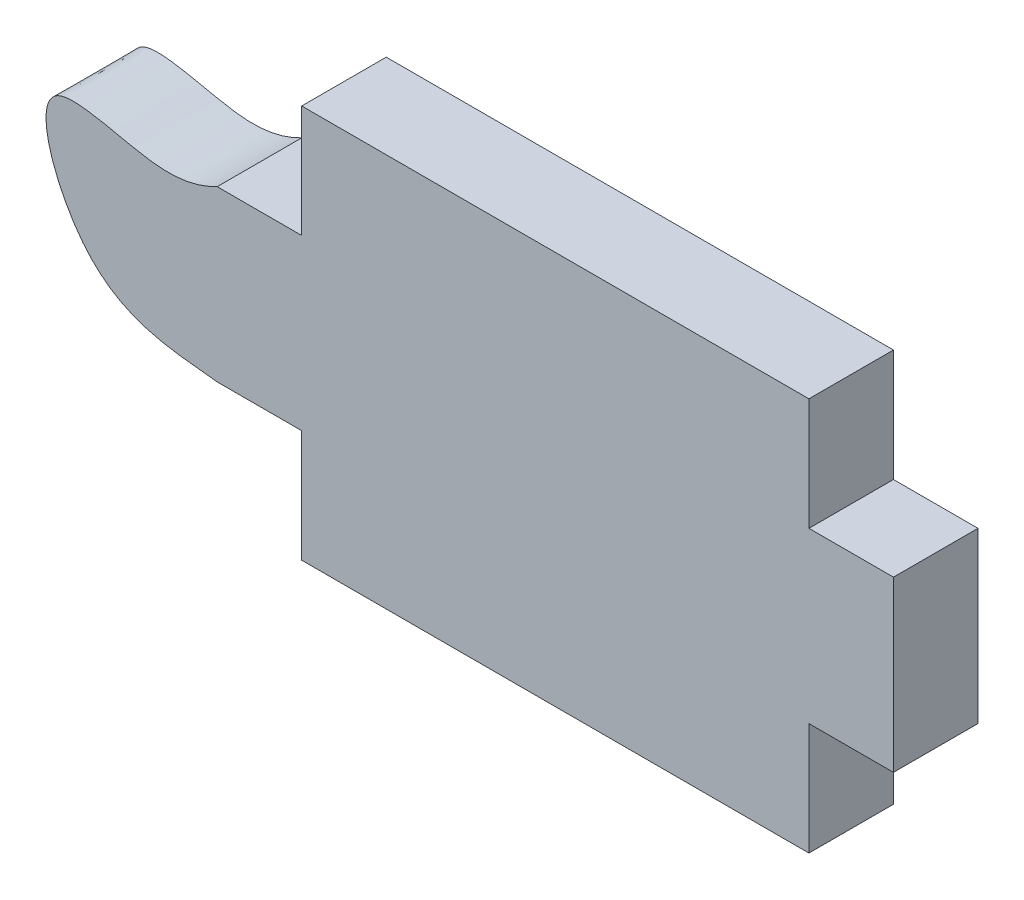
ISO-10303-21;
HEADER;
FILE_DESCRIPTION(('STEP AP214'),'2;1');
FILE_NAME('part.step','',(''),(''),'','','');
FILE_SCHEMA(('AUTOMOTIVE_DESIGN { 1 0 10303 214 1 1 1 1 }'));
ENDSEC;
DATA;
#1=APPLICATION_CONTEXT('core data for automotive mechanical design processes');
#2=APPLICATION_PROTOCOL_DEFINITION('international standard','automotive_design',2000,#1);
#3=PRODUCT_CONTEXT('',#1,'mechanical');
#4=PRODUCT('Part','Part','',(#3));
#5=PRODUCT_RELATED_PRODUCT_CATEGORY('part','',(#4));
#6=PRODUCT_DEFINITION_FORMATION('','',#4);
#7=PRODUCT_DEFINITION_CONTEXT('part definition',#1,'design');
#8=PRODUCT_DEFINITION('design','',#6,#7);
#9=PRODUCT_DEFINITION_SHAPE('','',#8);
#10=(LENGTH_UNIT() NAMED_UNIT(*) SI_UNIT(.MILLI.,.METRE.));
#11=(NAMED_UNIT(*) PLANE_ANGLE_UNIT() SI_UNIT($,.RADIAN.));
#12=(NAMED_UNIT(*) SI_UNIT($,.STERADIAN.) SOLID_ANGLE_UNIT());
#13=UNCERTAINTY_MEASURE_WITH_UNIT(LENGTH_MEASURE(1.E-05),#10,'distance_accuracy_value','');
#14=(GEOMETRIC_REPRESENTATION_CONTEXT(3) GLOBAL_UNCERTAINTY_ASSIGNED_CONTEXT((#13)) GLOBAL_UNIT_ASSIGNED_CONTEXT((#10,
#11,#12)) REPRESENTATION_CONTEXT('',''));
#15=CARTESIAN_POINT('',(0.,0.,0.));
#16=DIRECTION('',(0.,0.,1.));
#17=DIRECTION('',(1.,0.,0.));
#18=AXIS2_PLACEMENT_3D('',#15,#16,#17);
#19=CARTESIAN_POINT('',(-3.17499999999997,64.9634215549388,-3.175));
#20=DIRECTION('',(0.,-1.,0.));
#21=DIRECTION('',(0.,0.,-1.));
#22=AXIS2_PLACEMENT_3D('',#19,#20,#21);
#23=PLANE('',#22);
#24=DIRECTION('',(1.,0.,0.));
#25=VECTOR('',#24,1.);
#26=CARTESIAN_POINT('',(-3.17499999999997,64.9634215549388,0.));
#27=LINE('',#26,#25);
#28=CARTESIAN_POINT('',(-3.17499999999997,64.9634215549389,0.));
#29=VERTEX_POINT('',#28);
#30=CARTESIAN_POINT('',(0.,64.9634215549388,0.));
#31=VERTEX_POINT('',#30);
#32=EDGE_CURVE('E158',#29,#31,#27,.T.);
#33=ORIENTED_EDGE('',*,*,#32,.F.);
#34=DIRECTION('',(0.,0.,1.));
#35=VECTOR('',#34,1.);
#36=CARTESIAN_POINT('',(-3.17499999999997,64.9634215549389,-3.175));
#37=LINE('',#36,#35);
#38=CARTESIAN_POINT('',(-3.17499999999997,64.9634215549389,-3.175));
#39=VERTEX_POINT('',#38);
#40=EDGE_CURVE('E11',#39,#29,#37,.T.);
#41=ORIENTED_EDGE('',*,*,#40,.F.);
#42=DIRECTION('',(1.,0.,0.));
#43=VECTOR('',#42,1.);
#44=CARTESIAN_POINT('',(-3.17499999999997,64.9634215549388,-3.175));
#45=LINE('',#44,#43);
#46=CARTESIAN_POINT('',(0.,64.9634215549388,-3.175));
#47=VERTEX_POINT('',#46);
#48=EDGE_CURVE('E240',#39,#47,#45,.T.);
#49=ORIENTED_EDGE('',*,*,#48,.T.);
#50=DIRECTION('',(0.,0.,1.));
#51=VECTOR('',#50,1.);
#52=CARTESIAN_POINT('',(0.,64.9634215549388,-3.175));
#53=LINE('',#52,#51);
#54=EDGE_CURVE('E36',#47,#31,#53,.T.);
#55=ORIENTED_EDGE('',*,*,#54,.T.);
#56=EDGE_LOOP('',(#33,#41,#49,#55));
#57=FACE_BOUND('',#56,.T.);
#58=ADVANCED_FACE('F33',(#57),#23,.T.);
#59=CARTESIAN_POINT('',(-3.17499999999997,64.9634215549389,-3.175));
#60=CARTESIAN_POINT('',(-5.1086361062681,65.1682508847472,-3.175));
#61=CARTESIAN_POINT('',(-8.26678059926956,65.288799195504,-3.175));
#62=CARTESIAN_POINT('',(-10.4320897192248,71.6108567428969,-3.175));
#63=CARTESIAN_POINT('',(-6.445221982098,71.2022178436951,-3.175));
#64=CARTESIAN_POINT('',(-4.88110775068615,70.4406194275927,-3.175));
#65=CARTESIAN_POINT('',(-3.17499999999997,71.3134215549389,-3.175));
#66=B_SPLINE_CURVE_WITH_KNOTS('',3,(#59,#60,#61,#62,#63,#64,#65),.UNSPECIFIED.,.F.,.F.,(4,1,1,1,
4),(0.,0.353492234285644,0.624794572582007,0.705320644524616,1.),.UNSPECIFIED.);
#67=DIRECTION('',(0.,0.,1.));
#68=VECTOR('',#67,1.);
#69=SURFACE_OF_LINEAR_EXTRUSION('',#66,#68);
#70=CARTESIAN_POINT('',(-3.17499999999997,64.9634215549389,0.));
#71=CARTESIAN_POINT('',(-5.1086361062681,65.1682508847472,0.));
#72=CARTESIAN_POINT('',(-8.26678059926956,65.288799195504,0.));
#73=CARTESIAN_POINT('',(-10.4320897192248,71.6108567428969,0.));
#74=CARTESIAN_POINT('',(-6.445221982098,71.2022178436951,0.));
#75=CARTESIAN_POINT('',(-4.88110775068615,70.4406194275927,0.));
#76=CARTESIAN_POINT('',(-3.17499999999997,71.3134215549389,0.));
#77=B_SPLINE_CURVE_WITH_KNOTS('',3,(#70,#71,#72,#73,#74,#75,#76),.UNSPECIFIED.,.F.,.F.,(4,1,1,1,
4),(0.,0.353492234285644,0.624794572582007,0.705320644524616,1.),.UNSPECIFIED.);
#78=CARTESIAN_POINT('',(-3.17499999999997,71.3134215549389,0.));
#79=VERTEX_POINT('',#78);
#80=EDGE_CURVE('E90',#29,#79,#77,.T.);
#81=ORIENTED_EDGE('',*,*,#80,.T.);
#82=DIRECTION('',(0.,0.,1.));
#83=VECTOR('',#82,1.);
#84=CARTESIAN_POINT('',(-3.17499999999997,71.3134215549389,-3.175));
#85=LINE('',#84,#83);
#86=CARTESIAN_POINT('',(-3.17499999999997,71.3134215549389,-3.175));
#87=VERTEX_POINT('',#86);
#88=EDGE_CURVE('E42',#87,#79,#85,.T.);
#89=ORIENTED_EDGE('',*,*,#88,.F.);
#90=EDGE_CURVE('E133',#39,#87,#66,.T.);
#91=ORIENTED_EDGE('',*,*,#90,.F.);
#92=ORIENTED_EDGE('',*,*,#40,.T.);
#93=EDGE_LOOP('',(#81,#89,#91,#92));
#94=FACE_BOUND('',#93,.T.);
#95=ADVANCED_FACE('F164',(#94),#69,.F.);
#96=CARTESIAN_POINT('',(-3.17499999999997,71.3134215549389,-3.175));
#97=DIRECTION('',(0.,-1.,0.));
#98=DIRECTION('',(0.,0.,-1.));
#99=AXIS2_PLACEMENT_3D('',#96,#97,#98);
#100=PLANE('',#99);
#101=DIRECTION('',(1.,0.,0.));
#102=VECTOR('',#101,1.);
#103=CARTESIAN_POINT('',(-3.17499999999997,71.3134215549389,0.));
#104=LINE('',#103,#102);
#105=CARTESIAN_POINT('',(0.,71.3134215549389,0.));
#106=VERTEX_POINT('',#105);
#107=EDGE_CURVE('E140',#79,#106,#104,.T.);
#108=ORIENTED_EDGE('',*,*,#107,.T.);
#109=DIRECTION('',(0.,0.,1.));
#110=VECTOR('',#109,1.);
#111=CARTESIAN_POINT('',(0.,71.3134215549389,-3.175));
#112=LINE('',#111,#110);
#113=CARTESIAN_POINT('',(0.,71.3134215549389,-3.175));
#114=VERTEX_POINT('',#113);
#115=EDGE_CURVE('E137',#114,#106,#112,.T.);
#116=ORIENTED_EDGE('',*,*,#115,.F.);
#117=DIRECTION('',(1.,0.,0.));
#118=VECTOR('',#117,1.);
#119=CARTESIAN_POINT('',(-3.17499999999997,71.3134215549389,-3.175));
#120=LINE('',#119,#118);
#121=EDGE_CURVE('E128',#87,#114,#120,.T.);
#122=ORIENTED_EDGE('',*,*,#121,.F.);
#123=ORIENTED_EDGE('',*,*,#88,.T.);
#124=EDGE_LOOP('',(#108,#116,#122,#123));
#125=FACE_BOUND('',#124,.T.);
#126=ADVANCED_FACE('F138',(#125),#100,.F.);
#127=CARTESIAN_POINT('',(0.,75.5261823113577,-3.175));
#128=DIRECTION('',(-1.,0.,0.));
#129=DIRECTION('',(0.,-1.,0.));
#130=AXIS2_PLACEMENT_3D('',#127,#128,#129);
#131=PLANE('',#130);
#132=DIRECTION('',(0.,-1.,0.));
#133=VECTOR('',#132,1.);
#134=CARTESIAN_POINT('',(0.,75.5261823113577,0.));
#135=LINE('',#134,#133);
#136=CARTESIAN_POINT('',(0.,75.5261823113577,0.));
#137=VERTEX_POINT('',#136);
#138=EDGE_CURVE('E235',#137,#106,#135,.T.);
#139=ORIENTED_EDGE('',*,*,#138,.F.);
#140=DIRECTION('',(0.,0.,1.));
#141=VECTOR('',#140,1.);
#142=CARTESIAN_POINT('',(0.,75.5261823113577,-3.175));
#143=LINE('',#142,#141);
#144=CARTESIAN_POINT('',(0.,75.5261823113577,-3.175));
#145=VERTEX_POINT('',#144);
#146=EDGE_CURVE('E144',#145,#137,#143,.T.);
#147=ORIENTED_EDGE('',*,*,#146,.F.);
#148=DIRECTION('',(0.,-1.,0.));
#149=VECTOR('',#148,1.);
#150=CARTESIAN_POINT('',(0.,75.5261823113577,-3.175));
#151=LINE('',#150,#149);
#152=EDGE_CURVE('E132',#145,#114,#151,.T.);
#153=ORIENTED_EDGE('',*,*,#152,.T.);
#154=ORIENTED_EDGE('',*,*,#115,.T.);
#155=EDGE_LOOP('',(#139,#147,#153,#154));
#156=FACE_BOUND('',#155,.T.);
#157=ADVANCED_FACE('F146',(#156),#131,.T.);
#158=CARTESIAN_POINT('',(0.,75.5261823113577,-3.175));
#159=DIRECTION('',(0.,-1.,0.));
#160=DIRECTION('',(0.,0.,-1.));
#161=AXIS2_PLACEMENT_3D('',#158,#159,#160);
#162=PLANE('',#161);
#163=DIRECTION('',(1.,0.,0.));
#164=VECTOR('',#163,1.);
#165=CARTESIAN_POINT('',(0.,75.5261823113577,0.));
#166=LINE('',#165,#164);
#167=CARTESIAN_POINT('',(19.0499999999999,75.5261823113577,0.));
#168=VERTEX_POINT('',#167);
#169=EDGE_CURVE('E233',#137,#168,#166,.T.);
#170=ORIENTED_EDGE('',*,*,#169,.T.);
#171=DIRECTION('',(0.,0.,1.));
#172=VECTOR('',#171,1.);
#173=CARTESIAN_POINT('',(19.0499999999999,75.5261823113577,-3.175));
#174=LINE('',#173,#172);
#175=CARTESIAN_POINT('',(19.0499999999999,75.5261823113577,-3.175));
#176=VERTEX_POINT('',#175);
#177=EDGE_CURVE('E247',#176,#168,#174,.T.);
#178=ORIENTED_EDGE('',*,*,#177,.F.);
#179=DIRECTION('',(1.,0.,0.));
#180=VECTOR('',#179,1.);
#181=CARTESIAN_POINT('',(0.,75.5261823113577,-3.175));
#182=LINE('',#181,#180);
#183=EDGE_CURVE('E148',#145,#176,#182,.T.);
#184=ORIENTED_EDGE('',*,*,#183,.F.);
#185=ORIENTED_EDGE('',*,*,#146,.T.);
#186=EDGE_LOOP('',(#170,#178,#184,#185));
#187=FACE_BOUND('',#186,.T.);
#188=ADVANCED_FACE('F174',(#187),#162,.F.);
#189=CARTESIAN_POINT('',(19.0499999999999,75.5261823113577,-3.175));
#190=DIRECTION('',(-1.,0.,0.));
#191=DIRECTION('',(0.,0.,1.));
#192=AXIS2_PLACEMENT_3D('',#189,#190,#191);
#193=PLANE('',#192);
#194=DIRECTION('',(0.,-1.,0.));
#195=VECTOR('',#194,1.);
#196=CARTESIAN_POINT('',(19.0499999999999,75.5261823113577,0.));
#197=LINE('',#196,#195);
#198=CARTESIAN_POINT('',(19.0499999999999,71.3134215549389,0.));
#199=VERTEX_POINT('',#198);
#200=EDGE_CURVE('E230',#168,#199,#197,.T.);
#201=ORIENTED_EDGE('',*,*,#200,.T.);
#202=DIRECTION('',(0.,0.,1.));
#203=VECTOR('',#202,1.);
#204=CARTESIAN_POINT('',(19.0499999999999,71.3134215549389,-3.175));
#205=LINE('',#204,#203);
#206=CARTESIAN_POINT('',(19.0499999999999,71.3134215549389,-3.175));
#207=VERTEX_POINT('',#206);
#208=EDGE_CURVE('E250',#207,#199,#205,.T.);
#209=ORIENTED_EDGE('',*,*,#208,.F.);
#210=DIRECTION('',(0.,-1.,0.));
#211=VECTOR('',#210,1.);
#212=CARTESIAN_POINT('',(19.0499999999999,75.5261823113577,-3.175));
#213=LINE('',#212,#211);
#214=EDGE_CURVE('E150',#176,#207,#213,.T.);
#215=ORIENTED_EDGE('',*,*,#214,.F.);
#216=ORIENTED_EDGE('',*,*,#177,.T.);
#217=EDGE_LOOP('',(#201,#209,#215,#216));
#218=FACE_BOUND('',#217,.T.);
#219=ADVANCED_FACE('F177',(#218),#193,.F.);
#220=CARTESIAN_POINT('',(22.2249999999999,71.3134215549389,-3.175));
#221=DIRECTION('',(0.,1.,0.));
#222=DIRECTION('',(0.,0.,1.));
#223=AXIS2_PLACEMENT_3D('',#220,#221,#222);
#224=PLANE('',#223);
#225=DIRECTION('',(-1.,0.,0.));
#226=VECTOR('',#225,1.);
#227=CARTESIAN_POINT('',(22.2249999999999,71.3134215549389,0.));
#228=LINE('',#227,#226);
#229=CARTESIAN_POINT('',(22.2249999999999,71.3134215549389,0.));
#230=VERTEX_POINT('',#229);
#231=EDGE_CURVE('E227',#230,#199,#228,.T.);
#232=ORIENTED_EDGE('',*,*,#231,.F.);
#233=DIRECTION('',(0.,0.,1.));
#234=VECTOR('',#233,1.);
#235=CARTESIAN_POINT('',(22.2249999999999,71.3134215549389,-3.175));
#236=LINE('',#235,#234);
#237=CARTESIAN_POINT('',(22.2249999999999,71.3134215549389,-3.175));
#238=VERTEX_POINT('',#237);
#239=EDGE_CURVE('E252',#238,#230,#236,.T.);
#240=ORIENTED_EDGE('',*,*,#239,.F.);
#241=DIRECTION('',(-1.,0.,0.));
#242=VECTOR('',#241,1.);
#243=CARTESIAN_POINT('',(22.2249999999999,71.3134215549389,-3.175));
#244=LINE('',#243,#242);
#245=EDGE_CURVE('E278',#238,#207,#244,.T.);
#246=ORIENTED_EDGE('',*,*,#245,.T.);
#247=ORIENTED_EDGE('',*,*,#208,.T.);
#248=EDGE_LOOP('',(#232,#240,#246,#247));
#249=FACE_BOUND('',#248,.T.);
#250=ADVANCED_FACE('F181',(#249),#224,.T.);
#251=CARTESIAN_POINT('',(22.2249999999999,71.3134215549389,-3.175));
#252=DIRECTION('',(-1.,0.,0.));
#253=DIRECTION('',(0.,0.,1.));
#254=AXIS2_PLACEMENT_3D('',#251,#252,#253);
#255=PLANE('',#254);
#256=DIRECTION('',(0.,-1.,0.));
#257=VECTOR('',#256,1.);
#258=CARTESIAN_POINT('',(22.2249999999999,71.3134215549389,0.));
#259=LINE('',#258,#257);
#260=CARTESIAN_POINT('',(22.2249999999999,64.9634215549389,0.));
#261=VERTEX_POINT('',#260);
#262=EDGE_CURVE('E225',#230,#261,#259,.T.);
#263=ORIENTED_EDGE('',*,*,#262,.T.);
#264=DIRECTION('',(0.,0.,1.));
#265=VECTOR('',#264,1.);
#266=CARTESIAN_POINT('',(22.2249999999999,64.9634215549389,-3.175));
#267=LINE('',#266,#265);
#268=CARTESIAN_POINT('',(22.2249999999999,64.9634215549389,-3.175));
#269=VERTEX_POINT('',#268);
#270=EDGE_CURVE('E254',#269,#261,#267,.T.);
#271=ORIENTED_EDGE('',*,*,#270,.F.);
#272=DIRECTION('',(0.,-1.,0.));
#273=VECTOR('',#272,1.);
#274=CARTESIAN_POINT('',(22.2249999999999,71.3134215549389,-3.175));
#275=LINE('',#274,#273);
#276=EDGE_CURVE('E275',#238,#269,#275,.T.);
#277=ORIENTED_EDGE('',*,*,#276,.F.);
#278=ORIENTED_EDGE('',*,*,#239,.T.);
#279=EDGE_LOOP('',(#263,#271,#277,#278));
#280=FACE_BOUND('',#279,.T.);
#281=ADVANCED_FACE('F185',(#280),#255,.F.);
#282=CARTESIAN_POINT('',(22.2249999999999,64.9634215549389,-3.175));
#283=DIRECTION('',(0.,1.,0.));
#284=DIRECTION('',(0.,0.,1.));
#285=AXIS2_PLACEMENT_3D('',#282,#283,#284);
#286=PLANE('',#285);
#287=DIRECTION('',(-1.,0.,0.));
#288=VECTOR('',#287,1.);
#289=CARTESIAN_POINT('',(22.2249999999999,64.9634215549389,0.));
#290=LINE('',#289,#288);
#291=CARTESIAN_POINT('',(19.0499999999999,64.9634215549389,0.));
#292=VERTEX_POINT('',#291);
#293=EDGE_CURVE('E222',#261,#292,#290,.T.);
#294=ORIENTED_EDGE('',*,*,#293,.T.);
#295=DIRECTION('',(0.,0.,1.));
#296=VECTOR('',#295,1.);
#297=CARTESIAN_POINT('',(19.0499999999999,64.9634215549389,-3.175));
#298=LINE('',#297,#296);
#299=CARTESIAN_POINT('',(19.0499999999999,64.9634215549389,-3.175));
#300=VERTEX_POINT('',#299);
#301=EDGE_CURVE('E257',#300,#292,#298,.T.);
#302=ORIENTED_EDGE('',*,*,#301,.F.);
#303=DIRECTION('',(-1.,0.,0.));
#304=VECTOR('',#303,1.);
#305=CARTESIAN_POINT('',(22.2249999999999,64.9634215549389,-3.175));
#306=LINE('',#305,#304);
#307=EDGE_CURVE('E273',#269,#300,#306,.T.);
#308=ORIENTED_EDGE('',*,*,#307,.F.);
#309=ORIENTED_EDGE('',*,*,#270,.T.);
#310=EDGE_LOOP('',(#294,#302,#308,#309));
#311=FACE_BOUND('',#310,.T.);
#312=ADVANCED_FACE('F189',(#311),#286,.F.);
#313=CARTESIAN_POINT('',(19.0499999999999,60.75066079852,-3.175));
#314=DIRECTION('',(1.,0.,0.));
#315=DIRECTION('',(0.,1.,0.));
#316=AXIS2_PLACEMENT_3D('',#313,#314,#315);
#317=PLANE('',#316);
#318=DIRECTION('',(0.,1.,0.));
#319=VECTOR('',#318,1.);
#320=CARTESIAN_POINT('',(19.0499999999999,60.75066079852,0.));
#321=LINE('',#320,#319);
#322=CARTESIAN_POINT('',(19.0499999999999,60.75066079852,0.));
#323=VERTEX_POINT('',#322);
#324=EDGE_CURVE('E217',#323,#292,#321,.T.);
#325=ORIENTED_EDGE('',*,*,#324,.F.);
#326=DIRECTION('',(0.,0.,1.));
#327=VECTOR('',#326,1.);
#328=CARTESIAN_POINT('',(19.0499999999999,60.75066079852,-3.175));
#329=LINE('',#328,#327);
#330=CARTESIAN_POINT('',(19.0499999999999,60.75066079852,-3.175));
#331=VERTEX_POINT('',#330);
#332=EDGE_CURVE('E259',#331,#323,#329,.T.);
#333=ORIENTED_EDGE('',*,*,#332,.F.);
#334=DIRECTION('',(0.,1.,0.));
#335=VECTOR('',#334,1.);
#336=CARTESIAN_POINT('',(19.0499999999999,60.75066079852,-3.175));
#337=LINE('',#336,#335);
#338=EDGE_CURVE('E288',#331,#300,#337,.T.);
#339=ORIENTED_EDGE('',*,*,#338,.T.);
#340=ORIENTED_EDGE('',*,*,#301,.T.);
#341=EDGE_LOOP('',(#325,#333,#339,#340));
#342=FACE_BOUND('',#341,.T.);
#343=ADVANCED_FACE('F193',(#342),#317,.T.);
#344=CARTESIAN_POINT('',(0.,60.75066079852,-3.175));
#345=DIRECTION('',(0.,-1.,0.));
#346=DIRECTION('',(0.,0.,-1.));
#347=AXIS2_PLACEMENT_3D('',#344,#345,#346);
#348=PLANE('',#347);
#349=DIRECTION('',(1.,0.,0.));
#350=VECTOR('',#349,1.);
#351=CARTESIAN_POINT('',(0.,60.75066079852,0.));
#352=LINE('',#351,#350);
#353=CARTESIAN_POINT('',(0.,60.75066079852,0.));
#354=VERTEX_POINT('',#353);
#355=EDGE_CURVE('E215',#354,#323,#352,.T.);
#356=ORIENTED_EDGE('',*,*,#355,.F.);
#357=DIRECTION('',(0.,0.,1.));
#358=VECTOR('',#357,1.);
#359=CARTESIAN_POINT('',(0.,60.75066079852,-3.175));
#360=LINE('',#359,#358);
#361=CARTESIAN_POINT('',(0.,60.75066079852,-3.175));
#362=VERTEX_POINT('',#361);
#363=EDGE_CURVE('E260',#362,#354,#360,.T.);
#364=ORIENTED_EDGE('',*,*,#363,.F.);
#365=DIRECTION('',(1.,0.,0.));
#366=VECTOR('',#365,1.);
#367=CARTESIAN_POINT('',(0.,60.75066079852,-3.175));
#368=LINE('',#367,#366);
#369=EDGE_CURVE('E264',#362,#331,#368,.T.);
#370=ORIENTED_EDGE('',*,*,#369,.T.);
#371=ORIENTED_EDGE('',*,*,#332,.T.);
#372=EDGE_LOOP('',(#356,#364,#370,#371));
#373=FACE_BOUND('',#372,.T.);
#374=ADVANCED_FACE('F197',(#373),#348,.T.);
#375=CARTESIAN_POINT('',(0.,60.75066079852,-3.175));
#376=DIRECTION('',(1.,0.,0.));
#377=DIRECTION('',(0.,1.,0.));
#378=AXIS2_PLACEMENT_3D('',#375,#376,#377);
#379=PLANE('',#378);
#380=DIRECTION('',(0.,1.,0.));
#381=VECTOR('',#380,1.);
#382=CARTESIAN_POINT('',(0.,60.75066079852,0.));
#383=LINE('',#382,#381);
#384=EDGE_CURVE('E214',#354,#31,#383,.T.);
#385=ORIENTED_EDGE('',*,*,#384,.T.);
#386=ORIENTED_EDGE('',*,*,#54,.F.);
#387=DIRECTION('',(0.,1.,0.));
#388=VECTOR('',#387,1.);
#389=CARTESIAN_POINT('',(0.,60.75066079852,-3.175));
#390=LINE('',#389,#388);
#391=EDGE_CURVE('E100',#362,#47,#390,.T.);
#392=ORIENTED_EDGE('',*,*,#391,.F.);
#393=ORIENTED_EDGE('',*,*,#363,.T.);
#394=EDGE_LOOP('',(#385,#386,#392,#393));
#395=FACE_BOUND('',#394,.T.);
#396=ADVANCED_FACE('F200',(#395),#379,.F.);
#397=CARTESIAN_POINT('',(-9.54135538663944,69.7495435048285,-3.175));
#398=DIRECTION('',(0.,0.,-1.));
#399=DIRECTION('',(-1.,0.,0.));
#400=AXIS2_PLACEMENT_3D('',#397,#398,#399);
#401=PLANE('',#400);
#402=ORIENTED_EDGE('',*,*,#48,.F.);
#403=ORIENTED_EDGE('',*,*,#90,.T.);
#404=ORIENTED_EDGE('',*,*,#121,.T.);
#405=ORIENTED_EDGE('',*,*,#152,.F.);
#406=ORIENTED_EDGE('',*,*,#183,.T.);
#407=ORIENTED_EDGE('',*,*,#214,.T.);
#408=ORIENTED_EDGE('',*,*,#245,.F.);
#409=ORIENTED_EDGE('',*,*,#276,.T.);
#410=ORIENTED_EDGE('',*,*,#307,.T.);
#411=ORIENTED_EDGE('',*,*,#338,.F.);
#412=ORIENTED_EDGE('',*,*,#369,.F.);
#413=ORIENTED_EDGE('',*,*,#391,.T.);
#414=EDGE_LOOP('',(#402,#403,#404,#405,#406,#407,#408,#409,#410,#411,#412,#413));
#415=FACE_BOUND('',#414,.T.);
#416=ADVANCED_FACE('F130',(#415),#401,.T.);
#417=CARTESIAN_POINT('',(-9.54135538663944,69.7495435048285,0.));
#418=DIRECTION('',(0.,0.,-1.));
#419=DIRECTION('',(-1.,0.,0.));
#420=AXIS2_PLACEMENT_3D('',#417,#418,#419);
#421=PLANE('',#420);
#422=ORIENTED_EDGE('',*,*,#32,.T.);
#423=ORIENTED_EDGE('',*,*,#384,.F.);
#424=ORIENTED_EDGE('',*,*,#355,.T.);
#425=ORIENTED_EDGE('',*,*,#324,.T.);
#426=ORIENTED_EDGE('',*,*,#293,.F.);
#427=ORIENTED_EDGE('',*,*,#262,.F.);
#428=ORIENTED_EDGE('',*,*,#231,.T.);
#429=ORIENTED_EDGE('',*,*,#200,.F.);
#430=ORIENTED_EDGE('',*,*,#169,.F.);
#431=ORIENTED_EDGE('',*,*,#138,.T.);
#432=ORIENTED_EDGE('',*,*,#107,.F.);
#433=ORIENTED_EDGE('',*,*,#80,.F.);
#434=EDGE_LOOP('',(#422,#423,#424,#425,#426,#427,#428,#429,#430,#431,#432,#433));
#435=FACE_BOUND('',#434,.T.);
#436=ADVANCED_FACE('F168',(#435),#421,.F.);
#437=CLOSED_SHELL('',(#58,#95,#126,#157,#188,#219,#250,#281,#312,#343,#374,#396,#416,#436));
#438=MANIFOLD_SOLID_BREP('B2',#437);
#439=ADVANCED_BREP_SHAPE_REPRESENTATION('',(#18,#438),#14);
#440=SHAPE_DEFINITION_REPRESENTATION(#9,#439);
ENDSEC;
END-ISO-10303-21;
